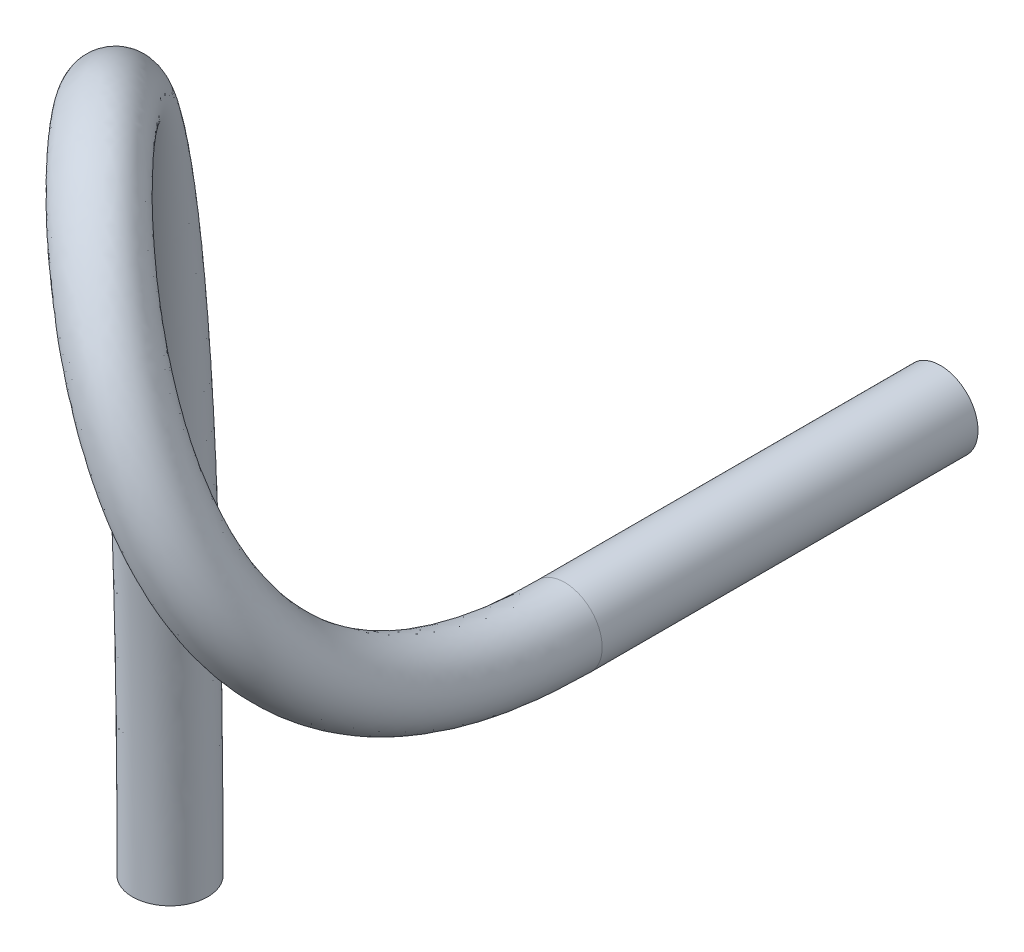
ISO-10303-21;
HEADER;
FILE_DESCRIPTION(('STEP AP214'),'2;1');
FILE_NAME('part.step','',(''),(''),'','','');
FILE_SCHEMA(('AUTOMOTIVE_DESIGN { 1 0 10303 214 1 1 1 1 }'));
ENDSEC;
DATA;
#1=APPLICATION_CONTEXT('core data for automotive mechanical design processes');
#2=APPLICATION_PROTOCOL_DEFINITION('international standard','automotive_design',2000,#1);
#3=PRODUCT_CONTEXT('',#1,'mechanical');
#4=PRODUCT('Part','Part','',(#3));
#5=PRODUCT_RELATED_PRODUCT_CATEGORY('part','',(#4));
#6=PRODUCT_DEFINITION_FORMATION('','',#4);
#7=PRODUCT_DEFINITION_CONTEXT('part definition',#1,'design');
#8=PRODUCT_DEFINITION('design','',#6,#7);
#9=PRODUCT_DEFINITION_SHAPE('','',#8);
#10=(LENGTH_UNIT() NAMED_UNIT(*) SI_UNIT(.MILLI.,.METRE.));
#11=(NAMED_UNIT(*) PLANE_ANGLE_UNIT() SI_UNIT($,.RADIAN.));
#12=(NAMED_UNIT(*) SI_UNIT($,.STERADIAN.) SOLID_ANGLE_UNIT());
#13=UNCERTAINTY_MEASURE_WITH_UNIT(LENGTH_MEASURE(1.E-05),#10,'distance_accuracy_value','');
#14=(GEOMETRIC_REPRESENTATION_CONTEXT(3) GLOBAL_UNCERTAINTY_ASSIGNED_CONTEXT((#13)) GLOBAL_UNIT_ASSIGNED_CONTEXT((#10,
#11,#12)) REPRESENTATION_CONTEXT('',''));
#15=CARTESIAN_POINT('',(0.,0.,0.));
#16=DIRECTION('',(0.,0.,1.));
#17=DIRECTION('',(1.,0.,0.));
#18=AXIS2_PLACEMENT_3D('',#15,#16,#17);
#19=CARTESIAN_POINT('',(0.,0.,0.));
#20=DIRECTION('',(0.,1.,0.));
#21=DIRECTION('',(0.,0.,1.));
#22=AXIS2_PLACEMENT_3D('',#19,#20,#21);
#23=PLANE('',#22);
#24=CARTESIAN_POINT('',(0.,0.,0.));
#25=DIRECTION('',(0.,1.,0.));
#26=DIRECTION('',(0.,0.,1.));
#27=AXIS2_PLACEMENT_3D('',#24,#25,#26);
#28=CIRCLE('',#27,0.75);
#29=CARTESIAN_POINT('',(0.,0.,0.75));
#30=VERTEX_POINT('',#29);
#31=EDGE_CURVE('E439',#30,#30,#28,.T.);
#32=ORIENTED_EDGE('',*,*,#31,.T.);
#33=EDGE_LOOP('',(#32));
#34=FACE_BOUND('',#33,.T.);
#35=CARTESIAN_POINT('',(0.,0.,0.));
#36=DIRECTION('',(0.,1.,0.));
#37=DIRECTION('',(0.,0.,1.));
#38=AXIS2_PLACEMENT_3D('',#35,#36,#37);
#39=CIRCLE('',#38,1.);
#40=CARTESIAN_POINT('',(0.,0.,1.));
#41=VERTEX_POINT('',#40);
#42=EDGE_CURVE('E401',#41,#41,#39,.T.);
#43=ORIENTED_EDGE('',*,*,#42,.F.);
#44=EDGE_LOOP('',(#43));
#45=FACE_BOUND('',#44,.T.);
#46=ADVANCED_FACE('F375',(#34,#45),#23,.F.);
#47=CARTESIAN_POINT('',(0.,0.,1.));
#48=CARTESIAN_POINT('',(0.00899547669460586,2.58069569188552,0.999642366474551));
#49=CARTESIAN_POINT('',(0.109017680083653,7.17772950391107,1.14717694766378));
#50=CARTESIAN_POINT('',(0.474614195177804,12.5035991778398,1.72099673212829));
#51=CARTESIAN_POINT('',(0.928594341117671,15.7533166492565,2.41739798412467));
#52=CARTESIAN_POINT('',(1.35854156297554,17.7054648960383,3.05243784311253));
#53=CARTESIAN_POINT('',(1.70655936488185,18.8626211914071,3.55178766920775));
#54=CARTESIAN_POINT('',(2.04025107157301,19.6589331272487,4.01416041473466));
#55=CARTESIAN_POINT('',(2.34681017564454,20.1901007234536,4.42357429300405));
#56=CARTESIAN_POINT('',(2.62033205464238,20.5333303169958,4.77568777707971));
#57=CARTESIAN_POINT('',(2.88836092381222,20.7592503172169,5.10623361142315));
#58=CARTESIAN_POINT('',(3.18090618077139,20.9013187638106,5.44946496645728));
#59=CARTESIAN_POINT('',(3.50375121959266,20.9416153026625,5.8039222611237));
#60=CARTESIAN_POINT('',(3.8758670365568,20.8590510586798,6.17753267987099));
#61=CARTESIAN_POINT('',(4.27876556045988,20.6501687054402,6.53985933744654));
#62=CARTESIAN_POINT('',(4.75957544411078,20.2800926207994,6.91584908911165));
#63=CARTESIAN_POINT('',(5.32104194657545,19.7113048221067,7.27113905301369));
#64=CARTESIAN_POINT('',(5.95253291569836,18.9320024086628,7.55397077978194));
#65=CARTESIAN_POINT('',(6.57944741814848,18.0417920794717,7.71234129109562));
#66=CARTESIAN_POINT('',(7.17869323391894,17.085448265498,7.7304533356402));
#67=CARTESIAN_POINT('',(7.73152214897381,16.1059163373045,7.59045761003957));
#68=CARTESIAN_POINT('',(8.22582951047412,15.1451875720223,7.27351358489649));
#69=CARTESIAN_POINT('',(8.65595705369681,14.2407651228999,6.76118485168429));
#70=CARTESIAN_POINT('',(9.02130398702978,13.4213815328392,6.03050929216346));
#71=CARTESIAN_POINT('',(9.29752457312053,12.7697497131797,5.12679124578931));
#72=CARTESIAN_POINT('',(9.49912776056318,12.280039069985,4.08279682395979));
#73=CARTESIAN_POINT('',(9.63832510361712,11.9378088119056,2.95010641614189));
#74=CARTESIAN_POINT('',(9.72971390534701,11.7178160422027,1.6077131631795));
#75=CARTESIAN_POINT('',(9.75553823348567,11.6664160401513,0.56061269576655));
#76=CARTESIAN_POINT('',(9.75819649130501,11.6706172936093,0.));
#77=CARTESIAN_POINT('',(-2.,0.,1.));
#78=CARTESIAN_POINT('',(-1.99069363358121,2.60299480784686,1.01827528736273));
#79=CARTESIAN_POINT('',(-1.89004965074379,7.24462685179503,1.20307571032826));
#80=CARTESIAN_POINT('',(-1.51642799449076,12.6601117879054,1.8502475161555));
#81=CARTESIAN_POINT('',(-1.04582700928725,16.0077868684583,2.62640556687591));
#82=CARTESIAN_POINT('',(-0.58864240216963,18.05971192098,3.34751507552876));
#83=CARTESIAN_POINT('',(-0.209267904874084,19.3034761519976,3.92769885524247));
#84=CARTESIAN_POINT('',(0.168411708738769,20.1890864489142,4.48574342973555));
#85=CARTESIAN_POINT('',(0.5326319078657,20.8039152050375,5.00581538446898));
#86=CARTESIAN_POINT('',(0.874677096685425,21.2170590057599,5.47874858809769));
#87=CARTESIAN_POINT('',(1.22877966911925,21.4961621864306,5.95104963716474));
#88=CARTESIAN_POINT('',(1.63255659198766,21.6640080526917,6.46808007499253));
#89=CARTESIAN_POINT('',(2.08512503965221,21.6751201376597,7.01656827189132));
#90=CARTESIAN_POINT('',(2.58048739540734,21.4889676664137,7.57138424292693));
#91=CARTESIAN_POINT('',(3.06975279972445,21.1260519647629,8.06512238217086));
#92=CARTESIAN_POINT('',(3.6007036457886,20.5529923922702,8.52849806206576));
#93=CARTESIAN_POINT('',(4.16455760129023,19.7421025292513,8.90976520044779));
#94=CARTESIAN_POINT('',(4.75554871297019,18.7013163653551,9.1470682275763));
#95=CARTESIAN_POINT('',(5.32738859521832,17.5723042513418,9.20696434060799));
#96=CARTESIAN_POINT('',(5.88027532420667,16.4084904010342,9.09955074256618));
#97=CARTESIAN_POINT('',(6.40699022453186,15.2470678499515,8.82507544819158));
#98=CARTESIAN_POINT('',(6.89647073639982,14.1185803778359,8.36669749302488));
#99=CARTESIAN_POINT('',(7.33710813014434,13.0555532285738,7.69576478126189));
#100=CARTESIAN_POINT('',(7.71767044585677,12.0955373747514,6.77955307503088));
#101=CARTESIAN_POINT('',(8.00159480707079,11.3481781961615,5.68593263774703));
#102=CARTESIAN_POINT('',(8.20076619876206,10.8058169517391,4.46884741750735));
#103=CARTESIAN_POINT('',(8.33064677939086,10.4415737915848,3.19011037660499));
#104=CARTESIAN_POINT('',(8.40728668316858,10.2193923953641,1.71614694394311));
#105=CARTESIAN_POINT('',(8.42057276794718,10.1778701462785,0.596757289354422));
#106=CARTESIAN_POINT('',(8.41696190408649,10.1870102762193,0.));
#107=CARTESIAN_POINT('',(-2.,0.,-1.));
#108=CARTESIAN_POINT('',(-2.00868458697042,2.64396399797926,-0.981009445586372));
#109=CARTESIAN_POINT('',(-1.94402251091136,7.3675344221921,-0.794778488519048));
#110=CARTESIAN_POINT('',(-1.62483607234795,12.960481439362,-0.127778696730119));
#111=CARTESIAN_POINT('',(-1.19061334777501,16.5134979972538,0.691747254824976));
#112=CARTESIAN_POINT('',(-0.74224896562198,18.7838817564187,1.48629129518241));
#113=CARTESIAN_POINT('',(-0.351390540888146,20.2225340604894,2.1518524379648));
#114=CARTESIAN_POINT('',(0.0638617140289006,21.3158557981678,2.8298496707215));
#115=CARTESIAN_POINT('',(0.495086080500928,22.1349429410731,3.50615512662986));
#116=CARTESIAN_POINT('',(0.929234316134916,22.7319662981724,4.1631660558001));
#117=CARTESIAN_POINT('',(1.41021822188391,23.1758636073831,4.86463459564465));
#118=CARTESIAN_POINT('',(1.98833456247443,23.48048411139,5.67677846702687));
#119=CARTESIAN_POINT('',(2.65525931921515,23.5575602033966,6.57379044524499));
#120=CARTESIAN_POINT('',(3.36769375198115,23.3395543294759,7.48631022895445));
#121=CARTESIAN_POINT('',(4.02784667880527,22.8782263285493,8.29082758685184));
#122=CARTESIAN_POINT('',(4.69092775756762,22.1589801594903,9.05232685511908));
#123=CARTESIAN_POINT('',(5.33497370813989,21.1629660255642,9.71958248997937));
#124=CARTESIAN_POINT('',(5.95725371490682,19.8935946196011,10.2313045369331));
#125=CARTESIAN_POINT('',(6.53307709225469,18.5028536266573,10.5180424042188));
#126=CARTESIAN_POINT('',(7.09059718970213,17.0439036883616,10.5720711814083));
#127=CARTESIAN_POINT('',(7.64186259325091,15.5573323888413,10.3799208739145));
#128=CARTESIAN_POINT('',(8.18179088212238,14.0789862433018,9.91301495998979));
#129=CARTESIAN_POINT('',(8.69186068942085,12.6556694788852,9.1301575448054));
#130=CARTESIAN_POINT('',(9.1438124717998,11.3567532720992,7.99513201088831));
#131=CARTESIAN_POINT('',(9.47685816082977,10.3571520750492,6.62521368831641));
#132=CARTESIAN_POINT('',(9.70006927138573,9.64993511849103,5.13338535540477));
#133=CARTESIAN_POINT('',(9.83610106434413,9.18611653480674,3.61136372944558));
#134=CARTESIAN_POINT('',(9.90684324747456,8.90336532889309,1.91046712711266));
#135=CARTESIAN_POINT('',(9.90949630097583,8.8450380659758,0.661530683744272));
#136=CARTESIAN_POINT('',(9.90056892147646,8.84577568900077,0.));
#137=CARTESIAN_POINT('',(0.,0.,-1.));
#138=CARTESIAN_POINT('',(-0.00899547669460571,2.62166488201792,-0.999642366474551));
#139=CARTESIAN_POINT('',(0.0550448199160775,7.30063707430814,-0.850677251183524));
#140=CARTESIAN_POINT('',(0.366206117320614,12.8039688292963,-0.257029480757328));
#141=CARTESIAN_POINT('',(0.783808002629909,16.259027778052,0.482739672073741));
#142=CARTESIAN_POINT('',(1.20493499952319,18.4296347314769,1.19121406276618));
#143=CARTESIAN_POINT('',(1.56443672886779,19.7816790998988,1.77594125193008));
#144=CARTESIAN_POINT('',(1.93570107686314,20.7857024765023,2.35826665572061));
#145=CARTESIAN_POINT('',(2.30926434827977,21.5211284594892,2.92391403516493));
#146=CARTESIAN_POINT('',(2.67488927409187,22.0482376094083,3.46010524478212));
#147=CARTESIAN_POINT('',(3.06979947657688,22.4389517381694,4.01981856990307));
#148=CARTESIAN_POINT('',(3.53668415125817,22.7177948225089,4.65816335849162));
#149=CARTESIAN_POINT('',(4.07388549915559,22.8240553683994,5.36114443447737));
#150=CARTESIAN_POINT('',(4.66307339313061,22.709637721742,6.0924586658985));
#151=CARTESIAN_POINT('',(5.2368594395407,22.4023430692266,6.76556454212753));
#152=CARTESIAN_POINT('',(5.8497995558898,21.8860803880194,7.43967788216496));
#153=CARTESIAN_POINT('',(6.49145805342512,21.1321683184196,8.08095634254527));
#154=CARTESIAN_POINT('',(7.15423791763498,20.1242806629087,8.63820708913877));
#155=CARTESIAN_POINT('',(7.78513591518485,18.9723414547872,9.02341935470645));
#156=CARTESIAN_POINT('',(8.3890150994144,17.7208615528253,9.20297377448237));
#157=CARTESIAN_POINT('',(8.96639451769286,16.4161808761943,9.1453030357625));
#158=CARTESIAN_POINT('',(9.51114965619668,15.1055934374882,8.81983105186141));
#159=CARTESIAN_POINT('',(10.0107096129733,13.8408813732112,8.1955776152278));
#160=CARTESIAN_POINT('',(10.4474460129728,12.682597430187,7.24608822802089));
#161=CARTESIAN_POINT('',(10.7727879268795,11.7787235920674,6.06607229635868));
#162=CARTESIAN_POINT('',(10.9984308331868,11.1241572367369,4.7473347618572));
#163=CARTESIAN_POINT('',(11.1437793885704,10.6823515551275,3.37135976898249));
#164=CARTESIAN_POINT('',(11.229270469653,10.4017889757317,1.80203334634905));
#165=CARTESIAN_POINT('',(11.2444617665143,10.3335839598487,0.625386090156399));
#166=CARTESIAN_POINT('',(11.241803508695,10.3293827063907,0.));
#167=CARTESIAN_POINT('',(2.,0.,-1.));
#168=CARTESIAN_POINT('',(1.99069363358121,2.59936576605657,-1.01827528736273));
#169=CARTESIAN_POINT('',(2.05411215074352,7.23373972642419,-0.906576013847999));
#170=CARTESIAN_POINT('',(2.35724830698918,12.6474562192307,-0.386280264784538));
#171=CARTESIAN_POINT('',(2.75822935303483,16.0045575588503,0.273732089322504));
#172=CARTESIAN_POINT('',(3.15211896466836,18.0753877065352,0.896136830349953));
#173=CARTESIAN_POINT('',(3.48026399862372,19.3408241393083,1.40003006589536));
#174=CARTESIAN_POINT('',(3.80754043969738,20.2555491548369,1.88668364071973));
#175=CARTESIAN_POINT('',(4.12344261605861,20.9073139779053,2.3416729437));
#176=CARTESIAN_POINT('',(4.42054423204883,21.3645089206443,2.75704443376413));
#177=CARTESIAN_POINT('',(4.72938073126986,21.7020398689558,3.17500254416148));
#178=CARTESIAN_POINT('',(5.0850337400419,21.9551055336278,3.63954824995638));
#179=CARTESIAN_POINT('',(5.49251167909605,22.0905505334022,4.14849842370975));
#180=CARTESIAN_POINT('',(5.95845303428006,22.0797211140082,4.69860710284256));
#181=CARTESIAN_POINT('',(6.44587220027613,21.926459809904,5.24030149740321));
#182=CARTESIAN_POINT('',(7.00867135421198,21.6131806165486,5.82702890921084));
#183=CARTESIAN_POINT('',(7.64794239871034,21.101370611275,6.44233019511117));
#184=CARTESIAN_POINT('',(8.35122212036314,20.3549667062164,7.04510964134441));
#185=CARTESIAN_POINT('',(9.03719473811501,19.4418292829171,7.52879630519409));
#186=CARTESIAN_POINT('',(9.68743300912667,18.3978194172891,7.83387636755639));
#187=CARTESIAN_POINT('',(10.2909264421348,17.2750293635473,7.91068519761049));
#188=CARTESIAN_POINT('',(10.840508430271,16.1322006316746,7.72664714373303));
#189=CARTESIAN_POINT('',(11.3295585365258,15.0260932675373,7.2609976856502));
#190=CARTESIAN_POINT('',(11.7510795541458,14.0084415882748,6.49704444515347));
#191=CARTESIAN_POINT('',(12.0687176929292,13.2002951090855,5.50693090440095));
#192=CARTESIAN_POINT('',(12.296792394988,12.5983793549829,4.36128416830964));
#193=CARTESIAN_POINT('',(12.4514577127967,12.1785865754483,3.1313558085194));
#194=CARTESIAN_POINT('',(12.5516976918314,11.9002126225704,1.69359956558543));
#195=CARTESIAN_POINT('',(12.5794272320528,11.8221298537215,0.589241496568527));
#196=CARTESIAN_POINT('',(12.5830380959135,11.8129897237807,0.));
#197=CARTESIAN_POINT('',(2.,0.,1.));
#198=CARTESIAN_POINT('',(2.00868458697042,2.55839657592417,0.981009445586372));
#199=CARTESIAN_POINT('',(2.1080850109111,7.11083215602712,1.09127818499931));
#200=CARTESIAN_POINT('',(2.46565638484637,12.3470865677742,1.59174594810108));
#201=CARTESIAN_POINT('',(2.90301569152259,15.4988464300547,2.20839040137343));
#202=CARTESIAN_POINT('',(3.30572552812071,17.3512178710965,2.7573606106963));
#203=CARTESIAN_POINT('',(3.62238663463778,18.4217662308166,3.17587648317303));
#204=CARTESIAN_POINT('',(3.91209043440725,19.1287798055832,3.54257739973378));
#205=CARTESIAN_POINT('',(4.16098844342338,19.5762862418697,3.84133320153913));
#206=CARTESIAN_POINT('',(4.36598701259933,19.8496016282318,4.07262696606172));
#207=CARTESIAN_POINT('',(4.5479421785052,20.0223384480033,4.26141758568156));
#208=CARTESIAN_POINT('',(4.72925576955513,20.1386294749295,4.43084985792204));
#209=CARTESIAN_POINT('',(4.92237739953311,20.2081104676653,4.59127625035607));
#210=CARTESIAN_POINT('',(5.17124667770625,20.229134450946,4.78368111681505));
#211=CARTESIAN_POINT('',(5.48777832119531,20.1742854461176,5.01459629272222));
#212=CARTESIAN_POINT('',(5.91844724243296,20.0071928493286,5.30320011615753));
#213=CARTESIAN_POINT('',(6.47752629186068,19.6805071149622,5.63251290557959));
#214=CARTESIAN_POINT('',(7.14951711842652,19.1626884519705,5.96087333198757));
#215=CARTESIAN_POINT('',(7.83150624107865,18.5112799076017,6.21771824158326));
#216=CARTESIAN_POINT('',(8.47711114363121,17.7624061299618,6.36135592871422));
#217=CARTESIAN_POINT('',(9.05605407341576,16.9647648246575,6.35583977188756));
#218=CARTESIAN_POINT('',(9.55518828454841,16.1717947662087,6.18032967676812));
#219=CARTESIAN_POINT('',(9.97480597724928,15.4259770172259,5.82660492210669));
#220=CARTESIAN_POINT('',(10.3249375282028,14.747225690927,5.28146550929604));
#221=CARTESIAN_POINT('',(10.5934543391703,14.1913212301978,4.56764985383158));
#222=CARTESIAN_POINT('',(10.7974893223643,13.7542611882309,3.69674623041223));
#223=CARTESIAN_POINT('',(10.9460034278434,13.4340438322263,2.7101024556788));
#224=CARTESIAN_POINT('',(11.0521411275254,13.2162396890414,1.49927938241588));
#225=CARTESIAN_POINT('',(11.0905036990242,13.1549619340242,0.524468102178678));
#226=CARTESIAN_POINT('',(11.0994310785235,13.1542243109992,0.));
#227=CARTESIAN_POINT('',(0.,0.,1.));
#228=CARTESIAN_POINT('',(0.00899547669460586,2.58069569188552,0.999642366474551));
#229=CARTESIAN_POINT('',(0.109017680083653,7.17772950391107,1.14717694766378));
#230=CARTESIAN_POINT('',(0.474614195177804,12.5035991778398,1.72099673212829));
#231=CARTESIAN_POINT('',(0.928594341117671,15.7533166492565,2.41739798412467));
#232=CARTESIAN_POINT('',(1.35854156297554,17.7054648960383,3.05243784311253));
#233=CARTESIAN_POINT('',(1.70655936488185,18.8626211914071,3.55178766920775));
#234=CARTESIAN_POINT('',(2.04025107157301,19.6589331272487,4.01416041473466));
#235=CARTESIAN_POINT('',(2.34681017564454,20.1901007234536,4.42357429300405));
#236=CARTESIAN_POINT('',(2.62033205464238,20.5333303169958,4.77568777707971));
#237=CARTESIAN_POINT('',(2.88836092381222,20.7592503172169,5.10623361142315));
#238=CARTESIAN_POINT('',(3.18090618077139,20.9013187638106,5.44946496645728));
#239=CARTESIAN_POINT('',(3.50375121959266,20.9416153026625,5.8039222611237));
#240=CARTESIAN_POINT('',(3.8758670365568,20.8590510586798,6.17753267987099));
#241=CARTESIAN_POINT('',(4.27876556045988,20.6501687054402,6.53985933744654));
#242=CARTESIAN_POINT('',(4.75957544411078,20.2800926207994,6.91584908911165));
#243=CARTESIAN_POINT('',(5.32104194657545,19.7113048221067,7.27113905301369));
#244=CARTESIAN_POINT('',(5.95253291569836,18.9320024086628,7.55397077978194));
#245=CARTESIAN_POINT('',(6.57944741814848,18.0417920794717,7.71234129109562));
#246=CARTESIAN_POINT('',(7.17869323391894,17.085448265498,7.7304533356402));
#247=CARTESIAN_POINT('',(7.73152214897381,16.1059163373045,7.59045761003957));
#248=CARTESIAN_POINT('',(8.22582951047412,15.1451875720223,7.27351358489649));
#249=CARTESIAN_POINT('',(8.65595705369681,14.2407651228999,6.76118485168429));
#250=CARTESIAN_POINT('',(9.02130398702978,13.4213815328392,6.03050929216346));
#251=CARTESIAN_POINT('',(9.29752457312053,12.7697497131797,5.12679124578931));
#252=CARTESIAN_POINT('',(9.49912776056318,12.280039069985,4.08279682395979));
#253=CARTESIAN_POINT('',(9.63832510361712,11.9378088119056,2.95010641614189));
#254=CARTESIAN_POINT('',(9.72971390534701,11.7178160422027,1.6077131631795));
#255=CARTESIAN_POINT('',(9.75553823348567,11.6664160401513,0.56061269576655));
#256=CARTESIAN_POINT('',(9.75819649130501,11.6706172936093,0.));
#257=(BOUNDED_SURFACE() B_SPLINE_SURFACE(3,3,((#47,#48,#49,#50,#51,#52,#53,#54,#55,#56,#57,#58,
#59,#60,#61,#62,#63,#64,#65,#66,#67,#68,#69,#70,#71,#72,#73,#74,#75,#76),(#77,#78,#79,#80,#81,
#82,#83,#84,#85,#86,#87,#88,#89,#90,#91,#92,#93,#94,#95,#96,#97,#98,#99,#100,#101,#102,#103,
#104,#105,#106),(#107,#108,#109,#110,#111,#112,#113,#114,#115,#116,#117,#118,#119,#120,#121,
#122,#123,#124,#125,#126,#127,#128,#129,#130,#131,#132,#133,#134,#135,#136),(#137,#138,#139,
#140,#141,#142,#143,#144,#145,#146,#147,#148,#149,#150,#151,#152,#153,#154,#155,#156,#157,#158,
#159,#160,#161,#162,#163,#164,#165,#166),(#167,#168,#169,#170,#171,#172,#173,#174,#175,#176,
#177,#178,#179,#180,#181,#182,#183,#184,#185,#186,#187,#188,#189,#190,#191,#192,#193,#194,#195,
#196),(#197,#198,#199,#200,#201,#202,#203,#204,#205,#206,#207,#208,#209,#210,#211,#212,#213,
#214,#215,#216,#217,#218,#219,#220,#221,#222,#223,#224,#225,#226),(#227,#228,#229,#230,#231,
#232,#233,#234,#235,#236,#237,#238,#239,#240,#241,#242,#243,#244,#245,#246,#247,#248,#249,#250,
#251,#252,#253,#254,#255,#256)),.UNSPECIFIED.,.T.,.F.,.F.) B_SPLINE_SURFACE_WITH_KNOTS((4,3,4),
(4,1,1,1,1,1,1,1,1,1,1,1,1,1,1,1,1,1,1,1,1,1,1,1,1,1,1,4),(0.,0.5,1.),(0.,0.0625,
0.124999999999795,0.187499999999832,0.218749999999999,0.25,0.281249999999953,0.304687499999883,
0.328125,0.3515625,0.374999999999839,0.406249999999991,0.4375,0.46875,0.500000000000055,
0.541666666666667,0.583333333333333,0.625,0.666666666666667,0.708333333333333,0.75,
0.791666666667163,0.833333333333333,0.875,0.906250000000008,0.9375,0.96875,1.),
.UNSPECIFIED.) GEOMETRIC_REPRESENTATION_ITEM() RATIONAL_B_SPLINE_SURFACE(((1.,1.,1.,1.,1.,1.,1.,
1.,1.,1.,1.,1.,1.,1.,1.,1.,1.,1.,1.,1.,1.,1.,1.,1.,1.,1.,1.,1.,1.,1.),(0.333333333333333,
0.333333333333333,0.333333333333333,0.333333333333333,0.333333333333333,0.333333333333333,
0.333333333333333,0.333333333333333,0.333333333333334,0.333333333333333,0.333333333333333,
0.333333333333333,0.333333333333333,0.333333333333333,0.333333333333333,0.333333333333333,
0.333333333333333,0.333333333333333,0.333333333333333,0.333333333333333,0.333333333333333,
0.333333333333333,0.333333333333333,0.333333333333333,0.333333333333333,0.333333333333333,
0.333333333333333,0.333333333333333,0.333333333333333,0.333333333333333),(0.333333333333333,
0.333333333333333,0.333333333333333,0.333333333333333,0.333333333333333,0.333333333333333,
0.333333333333333,0.333333333333333,0.333333333333334,0.333333333333333,0.333333333333333,
0.333333333333333,0.333333333333333,0.333333333333333,0.333333333333333,0.333333333333333,
0.333333333333333,0.333333333333333,0.333333333333333,0.333333333333333,0.333333333333333,
0.333333333333333,0.333333333333333,0.333333333333333,0.333333333333333,0.333333333333333,
0.333333333333333,0.333333333333333,0.333333333333333,0.333333333333333),(1.,1.,1.,1.,1.,1.,1.,
1.,1.,1.,1.,1.,1.,1.,1.,1.,1.,1.,1.,1.,1.,1.,1.,1.,1.,1.,1.,1.,1.,1.),(0.333333333333333,
0.333333333333333,0.333333333333333,0.333333333333333,0.333333333333333,0.333333333333333,
0.333333333333333,0.333333333333333,0.333333333333334,0.333333333333333,0.333333333333333,
0.333333333333333,0.333333333333333,0.333333333333333,0.333333333333333,0.333333333333333,
0.333333333333333,0.333333333333333,0.333333333333333,0.333333333333333,0.333333333333333,
0.333333333333333,0.333333333333333,0.333333333333333,0.333333333333333,0.333333333333333,
0.333333333333333,0.333333333333333,0.333333333333333,0.333333333333333),(0.333333333333333,
0.333333333333333,0.333333333333333,0.333333333333333,0.333333333333333,0.333333333333333,
0.333333333333333,0.333333333333333,0.333333333333334,0.333333333333333,0.333333333333333,
0.333333333333333,0.333333333333333,0.333333333333333,0.333333333333333,0.333333333333333,
0.333333333333333,0.333333333333333,0.333333333333333,0.333333333333333,0.333333333333333,
0.333333333333333,0.333333333333333,0.333333333333333,0.333333333333333,0.333333333333333,
0.333333333333333,0.333333333333333,0.333333333333333,0.333333333333333),(1.,1.,1.,1.,1.,1.,1.,
1.,1.,1.,1.,1.,1.,1.,1.,1.,1.,1.,1.,1.,1.,1.,1.,1.,1.,1.,1.,1.,1.,1.))) REPRESENTATION_ITEM('') SURFACE());
#258=CARTESIAN_POINT('',(0.,0.,1.));
#259=CARTESIAN_POINT('',(0.00899547669460586,2.58069569188552,0.999642366474551));
#260=CARTESIAN_POINT('',(0.109017680083653,7.17772950391107,1.14717694766378));
#261=CARTESIAN_POINT('',(0.474614195177804,12.5035991778398,1.72099673212829));
#262=CARTESIAN_POINT('',(0.928594341117671,15.7533166492565,2.41739798412467));
#263=CARTESIAN_POINT('',(1.35854156297554,17.7054648960383,3.05243784311253));
#264=CARTESIAN_POINT('',(1.70655936488185,18.8626211914071,3.55178766920775));
#265=CARTESIAN_POINT('',(2.04025107157301,19.6589331272487,4.01416041473466));
#266=CARTESIAN_POINT('',(2.34681017564454,20.1901007234536,4.42357429300405));
#267=CARTESIAN_POINT('',(2.62033205464238,20.5333303169958,4.77568777707971));
#268=CARTESIAN_POINT('',(2.88836092381222,20.7592503172169,5.10623361142315));
#269=CARTESIAN_POINT('',(3.18090618077139,20.9013187638106,5.44946496645728));
#270=CARTESIAN_POINT('',(3.50375121959266,20.9416153026625,5.8039222611237));
#271=CARTESIAN_POINT('',(3.8758670365568,20.8590510586798,6.17753267987099));
#272=CARTESIAN_POINT('',(4.27876556045988,20.6501687054402,6.53985933744654));
#273=CARTESIAN_POINT('',(4.75957544411078,20.2800926207994,6.91584908911165));
#274=CARTESIAN_POINT('',(5.32104194657545,19.7113048221067,7.27113905301369));
#275=CARTESIAN_POINT('',(5.95253291569836,18.9320024086628,7.55397077978194));
#276=CARTESIAN_POINT('',(6.57944741814848,18.0417920794717,7.71234129109562));
#277=CARTESIAN_POINT('',(7.17869323391894,17.085448265498,7.7304533356402));
#278=CARTESIAN_POINT('',(7.73152214897381,16.1059163373045,7.59045761003957));
#279=CARTESIAN_POINT('',(8.22582951047412,15.1451875720223,7.27351358489649));
#280=CARTESIAN_POINT('',(8.65595705369681,14.2407651228999,6.76118485168429));
#281=CARTESIAN_POINT('',(9.02130398702978,13.4213815328392,6.03050929216346));
#282=CARTESIAN_POINT('',(9.29752457312053,12.7697497131797,5.12679124578931));
#283=CARTESIAN_POINT('',(9.49912776056318,12.280039069985,4.08279682395979));
#284=CARTESIAN_POINT('',(9.63832510361712,11.9378088119056,2.95010641614189));
#285=CARTESIAN_POINT('',(9.72971390534701,11.7178160422027,1.6077131631795));
#286=CARTESIAN_POINT('',(9.75553823348567,11.6664160401513,0.56061269576655));
#287=CARTESIAN_POINT('',(9.75819649130501,11.6706172936093,0.));
#288=B_SPLINE_CURVE_WITH_KNOTS('',3,(#258,#259,#260,#261,#262,#263,#264,#265,#266,#267,#268,
#269,#270,#271,#272,#273,#274,#275,#276,#277,#278,#279,#280,#281,#282,#283,#284,#285,#286,#287),
.UNSPECIFIED.,.F.,.F.,(4,1,1,1,1,1,1,1,1,1,1,1,1,1,1,1,1,1,1,1,1,1,1,1,1,1,1,4),(0.,0.0625,
0.124999999999795,0.187499999999832,0.218749999999999,0.25,0.281249999999953,0.304687499999883,
0.328125,0.3515625,0.374999999999839,0.406249999999991,0.4375,0.46875,0.500000000000055,
0.541666666666667,0.583333333333333,0.625,0.666666666666667,0.708333333333333,0.75,
0.791666666667163,0.833333333333333,0.875,0.906250000000008,0.9375,0.96875,1.),.UNSPECIFIED.);
#289=CARTESIAN_POINT('',(9.758196491305,11.6706172936093,0.));
#290=VERTEX_POINT('',#289);
#291=EDGE_CURVE('E381',#41,#290,#288,.T.);
#292=CARTESIAN_POINT('',(10.5,11.,0.));
#293=DIRECTION('',(0.,0.,-1.));
#294=DIRECTION('',(-0.741803508694986,0.67061729360926,0.));
#295=AXIS2_PLACEMENT_3D('',#292,#293,#294);
#296=CIRCLE('',#295,1.);
#297=EDGE_CURVE('E12',#290,#290,#296,.T.);
#298=ORIENTED_EDGE('',*,*,#42,.T.);
#299=ORIENTED_EDGE('',*,*,#291,.T.);
#300=ORIENTED_EDGE('',*,*,#297,.F.);
#301=ORIENTED_EDGE('',*,*,#291,.F.);
#302=EDGE_LOOP('',(#298,#299,#300,#301));
#303=FACE_BOUND('',#302,.T.);
#304=ADVANCED_FACE('F407',(#303),#257,.F.);
#305=CARTESIAN_POINT('',(0.,0.,0.75));
#306=CARTESIAN_POINT('',(0.0067466075209544,2.58581684065207,0.749731774855913));
#307=CARTESIAN_POINT('',(0.102271072562706,7.19309295021071,0.897445172807869));
#308=CARTESIAN_POINT('',(0.461063185445655,12.5411453842718,1.47374345551759));
#309=CARTESIAN_POINT('',(0.910496048806701,15.8165305403559,2.1755656951183));
#310=CARTESIAN_POINT('',(1.33934074254399,17.7959861254681,2.81978487056924));
#311=CARTESIAN_POINT('',(1.68879403538009,18.9775034299686,3.32980686704804));
#312=CARTESIAN_POINT('',(2.02718232223427,19.7997792959054,3.8071736948579));
#313=CARTESIAN_POINT('',(2.34211694722394,20.3564791904581,4.23611676077416));
#314=CARTESIAN_POINT('',(2.62715170707357,20.7226937285474,4.61123996054251));
#315=CARTESIAN_POINT('',(2.91104074290781,20.969212994836,4.97043173123314));
#316=CARTESIAN_POINT('',(3.22537842708224,21.1283782711478,5.35055226546157));
#317=CARTESIAN_POINT('',(3.57501800453803,21.1769203108796,5.7485750327929));
#318=CARTESIAN_POINT('',(3.97426783112852,21.0903743915626,6.16689842812443));
#319=CARTESIAN_POINT('',(4.39852729534498,20.8691905009135,6.56807248803166));
#320=CARTESIAN_POINT('',(4.89585345808315,20.4808410917019,6.98132768824331));
#321=CARTESIAN_POINT('',(5.46734395993166,19.8889127591459,7.37236621420514));
#322=CARTESIAN_POINT('',(6.10274604094043,19.0810371904436,7.68950031845154));
#323=CARTESIAN_POINT('',(6.73015848027803,18.1581107513862,7.87622604904698));
#324=CARTESIAN_POINT('',(7.32998346710587,17.1648749264139,7.91451839049547));
#325=CARTESIAN_POINT('',(7.88588119506369,16.1446994046657,7.78481328825494));
#326=CARTESIAN_POINT('',(8.38649452868944,15.1402383052055,7.46680326826711));
#327=CARTESIAN_POINT('',(8.82530112360637,14.1907796541888,6.94048394712723));
#328=CARTESIAN_POINT('',(9.19957174027266,13.3290335200077,6.18245665914564));
#329=CARTESIAN_POINT('',(9.4819324923404,12.6458714480406,5.24420137711048));
#330=CARTESIAN_POINT('',(9.68654064464113,12.135553840829,4.16586406619697));
#331=CARTESIAN_POINT('',(9.82650688923628,11.7808766548083,3.00276308524697));
#332=CARTESIAN_POINT('',(9.91715847588525,11.5533126588939,1.63200318607569));
#333=CARTESIAN_POINT('',(9.94165367511425,11.4998120301135,0.568709370065281));
#334=CARTESIAN_POINT('',(9.94364736847876,11.502962970207,0.));
#335=CARTESIAN_POINT('',(-1.5,0.,0.75));
#336=CARTESIAN_POINT('',(-1.49302022518591,2.60254117762307,0.763706465522047));
#337=CARTESIAN_POINT('',(-1.39702942555788,7.24326596112367,0.939369244806226));
#338=CARTESIAN_POINT('',(-1.03221845680577,12.6585298418211,1.57068154353799));
#339=CARTESIAN_POINT('',(-0.570319963996991,16.0073832047573,2.33232138218173));
#340=CARTESIAN_POINT('',(-0.121047231314882,18.0616713941744,3.04109279488141));
#341=CARTESIAN_POINT('',(0.251923583063142,19.3081446504115,3.61174025657408));
#342=CARTESIAN_POINT('',(0.623302800108594,20.1973942871545,4.16086095610857));
#343=CARTESIAN_POINT('',(0.981483246389813,20.816840051646,4.67279757937286));
#344=CARTESIAN_POINT('',(1.31791048860585,21.2354902451204,5.138535568806));
#345=CARTESIAN_POINT('',(1.66635480188807,21.5218968967462,5.60404375053933));
#346=CARTESIAN_POINT('',(2.06411623549444,21.7003952378087,6.11451359686301));
#347=CARTESIAN_POINT('',(2.51104836958269,21.7270489371275,6.65805954086862));
#348=CARTESIAN_POINT('',(3.00273310026643,21.562811847363,7.21228710041639));
#349=CARTESIAN_POINT('',(3.49176772479341,21.2261029454055,7.7120197715749));
#350=CARTESIAN_POINT('',(4.02669960934152,20.685515920305,8.1908144179589));
#351=CARTESIAN_POINT('',(4.59998070096774,19.9120110395043,8.60133582478072));
#352=CARTESIAN_POINT('',(5.20500788889431,18.9080226579628,8.88432340429731));
#353=CARTESIAN_POINT('',(5.79111436308041,17.8059948802887,8.99719333618125));
#354=CARTESIAN_POINT('',(6.35617003482167,16.6571565280661,8.94134144568996));
#355=CARTESIAN_POINT('',(6.89248225173223,15.500563039151,8.71077666686895));
#356=CARTESIAN_POINT('',(7.38947544813372,14.3702829095658,8.28669119936339));
#357=CARTESIAN_POINT('',(7.83616443094202,13.3018707334442,7.64141889431043));
#358=CARTESIAN_POINT('',(8.2218465843929,12.3346504014418,6.7442394962962));
#359=CARTESIAN_POINT('',(8.5099851678031,11.579692810277,5.66355742107877));
#360=CARTESIAN_POINT('',(8.7127694732903,11.0298872521445,4.45540201135764));
#361=CARTESIAN_POINT('',(8.84574814606659,10.6587003895677,3.18276605559429));
#362=CARTESIAN_POINT('',(8.92533805925144,10.4294949237649,1.7133285216484));
#363=CARTESIAN_POINT('',(8.94042957596039,10.3834026097089,0.595817815256185));
#364=CARTESIAN_POINT('',(8.93772142806487,10.3902577071645,0.));
#365=CARTESIAN_POINT('',(-1.5,0.,-0.75));
#366=CARTESIAN_POINT('',(-1.50651344022781,2.63326807022237,-0.735757084189779));
#367=CARTESIAN_POINT('',(-1.43750907068356,7.33544663892148,-0.559021404329254));
#368=CARTESIAN_POINT('',(-1.11352451519866,12.8838070804135,0.0871618838737809));
#369=CARTESIAN_POINT('',(-0.678909717862813,16.3866665513539,0.881327648143533));
#370=CARTESIAN_POINT('',(-0.236252153904145,18.6047987707534,1.64517495962165));
#371=CARTESIAN_POINT('',(0.145331606052596,19.9974380817803,2.27985544361583));
#372=CARTESIAN_POINT('',(0.544890304076193,21.0424712990947,2.91894063684803));
#373=CARTESIAN_POINT('',(0.953323875866235,21.8151108536727,3.54805238599352));
#374=CARTESIAN_POINT('',(1.35882840319297,22.3716707144298,4.15184866958281));
#375=CARTESIAN_POINT('',(1.80243371646157,22.7816729624606,4.78923246939927));
#376=CARTESIAN_POINT('',(2.33094971335952,23.0627522818324,5.52103739088876));
#377=CARTESIAN_POINT('',(2.93864907925489,23.1388789864302,6.32597617088388));
#378=CARTESIAN_POINT('',(3.59313786769679,22.9507518446596,7.14848158993702));
#379=CARTESIAN_POINT('',(4.21033813410402,22.5402337182453,7.88129867508564));
#380=CARTESIAN_POINT('',(4.84436769317579,21.8900067457201,8.58368601274889));
#381=CARTESIAN_POINT('',(5.47779278110499,20.9776586617389,9.2086987919294));
#382=CARTESIAN_POINT('',(6.10628664034678,19.8022313486472,9.69750063631495));
#383=CARTESIAN_POINT('',(6.69538073585769,18.5039069117753,9.98050188388937));
#384=CARTESIAN_POINT('',(7.26391143394326,17.1337164935616,10.0457317748216));
#385=CARTESIAN_POINT('',(7.81863652827152,15.7332614433183,9.87691073616114));
#386=CARTESIAN_POINT('',(8.35346555742564,14.3405873086652,9.44642929958709));
#387=CARTESIAN_POINT('',(8.85222885039941,13.0019579211778,8.71721346696807));
#388=CARTESIAN_POINT('',(9.29145310385018,11.7805623244527,7.65592369818927));
#389=CARTESIAN_POINT('',(9.61643268312233,10.8364232194428,6.3680182090058));
#390=CARTESIAN_POINT('',(9.83724677775805,10.1629758772085,4.9538054647807));
#391=CARTESIAN_POINT('',(9.97483885978154,9.71710744698419,3.49870607022474));
#392=CARTESIAN_POINT('',(10.0500054824809,9.44247462391163,1.85906865902557));
#393=CARTESIAN_POINT('',(10.0571222257319,9.38377854948185,0.644397861048573));
#394=CARTESIAN_POINT('',(10.0504266911073,9.38433176675058,0.));
#395=CARTESIAN_POINT('',(0.,0.,-0.75));
#396=CARTESIAN_POINT('',(-0.00674660752095428,2.61654373325137,-0.749731774855913));
#397=CARTESIAN_POINT('',(0.0617914274370245,7.28527362800851,-0.60094547632761));
#398=CARTESIAN_POINT('',(0.379757127052762,12.7664226228643,-0.00977620414662617));
#399=CARTESIAN_POINT('',(0.801906294940879,16.1958138869526,0.724571961080107));
#400=CARTESIAN_POINT('',(1.22413581995473,18.3391135020471,1.42386703530948));
#401=CARTESIAN_POINT('',(1.58220205836955,19.6667968613374,1.99792205408979));
#402=CARTESIAN_POINT('',(1.94876982620187,20.6448563078456,2.56525337559737));
#403=CARTESIAN_POINT('',(2.31395757670037,21.3547499924848,3.11137156739482));
#404=CARTESIAN_POINT('',(2.66806962166068,21.8588741978568,3.62455306131932));
#405=CARTESIAN_POINT('',(3.0471196574813,22.2289890605504,4.15562045009308));
#406=CARTESIAN_POINT('',(3.49221190494732,22.4907353151716,4.75707605948733));
#407=CARTESIAN_POINT('',(4.00261871421023,22.5887503601823,5.41649166280816));
#408=CARTESIAN_POINT('',(4.56467259855888,22.4783143888592,6.10309291764507));
#409=CARTESIAN_POINT('',(5.11709770465559,22.1833212737533,6.7373513915424));
#410=CARTESIAN_POINT('',(5.71352154191742,21.6853319171169,7.3741992830333));
#411=CARTESIAN_POINT('',(6.34515604006891,20.9545603813805,7.97972918135383));
#412=CARTESIAN_POINT('',(7.0040247923929,19.975245881128,8.50267755046917));
#413=CARTESIAN_POINT('',(7.63442485305531,18.8560227828728,8.8595345967551));
#414=CARTESIAN_POINT('',(8.23772486622747,17.6414348919094,9.0189087196271));
#415=CARTESIAN_POINT('',(8.81203547160298,16.3773978088331,8.95094735754714));
#416=CARTESIAN_POINT('',(9.35048463798136,15.110542704305,8.62654136849079));
#417=CARTESIAN_POINT('',(9.84136554306377,13.8908668419223,8.01627851978486));
#418=CARTESIAN_POINT('',(10.2691782597299,12.7749454430185,7.0941408610387));
#419=CARTESIAN_POINT('',(10.5883800076596,11.9026018572064,5.94866216503751));
#420=CARTESIAN_POINT('',(10.8110179491089,11.2686424658929,4.66426751962003));
#421=CARTESIAN_POINT('',(10.9555976029512,10.8392837122248,3.31870309987742));
#422=CARTESIAN_POINT('',(11.0418258991147,10.5662923590406,1.77774332345285));
#423=CARTESIAN_POINT('',(11.0583463248857,10.5001879698865,0.617289415857668));
#424=CARTESIAN_POINT('',(11.0563526315212,10.4970370297931,0.));
#425=CARTESIAN_POINT('',(1.5,0.,-0.75));
#426=CARTESIAN_POINT('',(1.49302022518591,2.59981939628036,-0.763706465522047));
#427=CARTESIAN_POINT('',(1.56109192555761,7.23510061709554,-0.642869548325967));
#428=CARTESIAN_POINT('',(1.87303876930419,12.649038165315,-0.106714292167033));
#429=CARTESIAN_POINT('',(2.28272230774457,16.0049612225512,0.567816274016679));
#430=CARTESIAN_POINT('',(2.68452379381361,18.0734282333408,1.2025591109973));
#431=CARTESIAN_POINT('',(3.01907251068649,19.3361556408945,1.71598866456375));
#432=CARTESIAN_POINT('',(3.35264934832755,20.2472413165965,2.2115661143467));
#433=CARTESIAN_POINT('',(3.6745912775345,20.8943891312968,2.67469074879612));
#434=CARTESIAN_POINT('',(3.9773108401284,21.3460776812838,3.09725745305583));
#435=CARTESIAN_POINT('',(4.29180559850103,21.6763051586401,3.52200843078689));
#436=CARTESIAN_POINT('',(4.65347409653512,21.9187183485108,3.9931147280859));
#437=CARTESIAN_POINT('',(5.06658834916557,22.0386217339344,4.50700715473245));
#438=CARTESIAN_POINT('',(5.53620732942097,22.0058769330588,5.05770424535311));
#439=CARTESIAN_POINT('',(6.02385727520717,21.8264088292614,5.59340410799916));
#440=CARTESIAN_POINT('',(6.58267539065906,21.4806570885138,6.16471255331771));
#441=CARTESIAN_POINT('',(7.21251929903282,20.931462101022,6.75075957077825));
#442=CARTESIAN_POINT('',(7.90176294443902,20.1482604136088,7.30785446462339));
#443=CARTESIAN_POINT('',(8.57346897025293,19.2081386539702,7.73856730962083));
#444=CARTESIAN_POINT('',(9.21153829851167,18.1491532902572,7.99208566443261));
#445=CARTESIAN_POINT('',(9.80543441493444,17.0215341743478,8.02498397893313));
#446=CARTESIAN_POINT('',(10.3475037185371,15.8804980999447,7.80665343739451));
#447=CARTESIAN_POINT('',(10.8305022357281,14.7797757626669,7.31534357260166));
#448=CARTESIAN_POINT('',(11.2469034156097,13.7693285615844,6.53235802388814));
#449=CARTESIAN_POINT('',(11.5603273321969,12.96878049497,5.52930612106921));
#450=CARTESIAN_POINT('',(11.7847891204597,12.3743090545774,4.37472957445936));
#451=CARTESIAN_POINT('',(11.9363563461209,11.9614599774653,3.1387001295301));
#452=CARTESIAN_POINT('',(12.0336463157486,11.6901100941696,1.69641798788014));
#453=CARTESIAN_POINT('',(12.0595704240396,11.6165973902912,0.590180970666764));
#454=CARTESIAN_POINT('',(12.0622785719351,11.6097422928355,0.));
#455=CARTESIAN_POINT('',(1.5,0.,0.75));
#456=CARTESIAN_POINT('',(1.50651344022781,2.56909250368106,0.735757084189779));
#457=CARTESIAN_POINT('',(1.60157157068329,7.14291993929774,0.855521100809513));
#458=CARTESIAN_POINT('',(1.95434482769708,12.4237609267226,1.37680536749718));
#459=CARTESIAN_POINT('',(2.39131206161039,15.6256778759546,2.01881000805488));
#460=CARTESIAN_POINT('',(2.79972871640287,17.5303008567618,2.59847694625707));
#461=CARTESIAN_POINT('',(3.12566448769704,18.6468622095257,3.047873477522));
#462=CARTESIAN_POINT('',(3.43106184435995,19.4021643046563,3.45348643360724));
#463=CARTESIAN_POINT('',(3.70275064805808,19.8961183292701,3.79943594217547));
#464=CARTESIAN_POINT('',(3.93639292554128,20.2098972119744,4.08394435227902));
#465=CARTESIAN_POINT('',(4.15572668392754,20.4165290929257,4.33681971192695));
#466=CARTESIAN_POINT('',(4.38664061867004,20.556361304487,4.58659093406014));
#467=CARTESIAN_POINT('',(4.63898763949337,20.6267916846317,4.83909052471719));
#468=CARTESIAN_POINT('',(4.94580256199061,20.6179369357622,5.12150975583247));
#469=CARTESIAN_POINT('',(5.30528686589656,20.5122780564216,5.42412520448842));
#470=CARTESIAN_POINT('',(5.76500730682479,20.2761662630988,5.77184095852772));
#471=CARTESIAN_POINT('',(6.33470721889558,19.8658144787874,6.14339660362956));
#472=CARTESIAN_POINT('',(7.00048419298655,19.2540517229243,6.49467723260576));
#473=CARTESIAN_POINT('',(7.66920259747565,18.5102266224836,6.7552587619127));
#474=CARTESIAN_POINT('',(8.30379689939007,17.6725933247617,6.88769533530099));
#475=CARTESIAN_POINT('',(8.87928013839515,16.7888357701805,6.85884990964093));
#476=CARTESIAN_POINT('',(9.38351360924516,15.9101937008453,6.64691533717082));
#477=CARTESIAN_POINT('',(9.81443781627073,15.0796885749333,6.23954899994403));
#478=CARTESIAN_POINT('',(10.1772968961524,14.3234166385735,5.62067382199507));
#479=CARTESIAN_POINT('',(10.4538798168777,13.7120500858042,4.82484533314218));
#480=CARTESIAN_POINT('',(10.660311815992,13.2412204295134,3.8763261210363));
#481=CARTESIAN_POINT('',(10.807265632406,12.9030529200489,2.82276011489965));
#482=CARTESIAN_POINT('',(10.9089788925191,12.6771303940229,1.55067785050298));
#483=CARTESIAN_POINT('',(10.9428777742681,12.6162214505182,0.541600924874377));
#484=CARTESIAN_POINT('',(10.9495733088926,12.6156682332494,0.));
#485=CARTESIAN_POINT('',(0.,0.,0.75));
#486=CARTESIAN_POINT('',(0.0067466075209544,2.58581684065207,0.749731774855913));
#487=CARTESIAN_POINT('',(0.102271072562706,7.19309295021071,0.897445172807869));
#488=CARTESIAN_POINT('',(0.461063185445655,12.5411453842718,1.47374345551759));
#489=CARTESIAN_POINT('',(0.910496048806701,15.8165305403559,2.1755656951183));
#490=CARTESIAN_POINT('',(1.33934074254399,17.7959861254681,2.81978487056924));
#491=CARTESIAN_POINT('',(1.68879403538009,18.9775034299686,3.32980686704804));
#492=CARTESIAN_POINT('',(2.02718232223427,19.7997792959054,3.8071736948579));
#493=CARTESIAN_POINT('',(2.34211694722394,20.3564791904581,4.23611676077416));
#494=CARTESIAN_POINT('',(2.62715170707357,20.7226937285474,4.61123996054251));
#495=CARTESIAN_POINT('',(2.91104074290781,20.969212994836,4.97043173123314));
#496=CARTESIAN_POINT('',(3.22537842708224,21.1283782711478,5.35055226546157));
#497=CARTESIAN_POINT('',(3.57501800453803,21.1769203108796,5.7485750327929));
#498=CARTESIAN_POINT('',(3.97426783112852,21.0903743915626,6.16689842812443));
#499=CARTESIAN_POINT('',(4.39852729534498,20.8691905009135,6.56807248803166));
#500=CARTESIAN_POINT('',(4.89585345808315,20.4808410917019,6.98132768824331));
#501=CARTESIAN_POINT('',(5.46734395993166,19.8889127591459,7.37236621420514));
#502=CARTESIAN_POINT('',(6.10274604094043,19.0810371904436,7.68950031845154));
#503=CARTESIAN_POINT('',(6.73015848027803,18.1581107513862,7.87622604904698));
#504=CARTESIAN_POINT('',(7.32998346710587,17.1648749264139,7.91451839049547));
#505=CARTESIAN_POINT('',(7.88588119506369,16.1446994046657,7.78481328825494));
#506=CARTESIAN_POINT('',(8.38649452868944,15.1402383052055,7.46680326826711));
#507=CARTESIAN_POINT('',(8.82530112360637,14.1907796541888,6.94048394712723));
#508=CARTESIAN_POINT('',(9.19957174027266,13.3290335200077,6.18245665914564));
#509=CARTESIAN_POINT('',(9.4819324923404,12.6458714480406,5.24420137711048));
#510=CARTESIAN_POINT('',(9.68654064464113,12.135553840829,4.16586406619697));
#511=CARTESIAN_POINT('',(9.82650688923628,11.7808766548083,3.00276308524697));
#512=CARTESIAN_POINT('',(9.91715847588525,11.5533126588939,1.63200318607569));
#513=CARTESIAN_POINT('',(9.94165367511425,11.4998120301135,0.568709370065281));
#514=CARTESIAN_POINT('',(9.94364736847876,11.502962970207,0.));
#515=(BOUNDED_SURFACE() B_SPLINE_SURFACE(3,3,((#305,#306,#307,#308,#309,#310,#311,#312,#313,
#314,#315,#316,#317,#318,#319,#320,#321,#322,#323,#324,#325,#326,#327,#328,#329,#330,#331,#332,
#333,#334),(#335,#336,#337,#338,#339,#340,#341,#342,#343,#344,#345,#346,#347,#348,#349,#350,
#351,#352,#353,#354,#355,#356,#357,#358,#359,#360,#361,#362,#363,#364),(#365,#366,#367,#368,
#369,#370,#371,#372,#373,#374,#375,#376,#377,#378,#379,#380,#381,#382,#383,#384,#385,#386,#387,
#388,#389,#390,#391,#392,#393,#394),(#395,#396,#397,#398,#399,#400,#401,#402,#403,#404,#405,
#406,#407,#408,#409,#410,#411,#412,#413,#414,#415,#416,#417,#418,#419,#420,#421,#422,#423,#424),
(#425,#426,#427,#428,#429,#430,#431,#432,#433,#434,#435,#436,#437,#438,#439,#440,#441,#442,#443,
#444,#445,#446,#447,#448,#449,#450,#451,#452,#453,#454),(#455,#456,#457,#458,#459,#460,#461,
#462,#463,#464,#465,#466,#467,#468,#469,#470,#471,#472,#473,#474,#475,#476,#477,#478,#479,#480,
#481,#482,#483,#484),(#485,#486,#487,#488,#489,#490,#491,#492,#493,#494,#495,#496,#497,#498,
#499,#500,#501,#502,#503,#504,#505,#506,#507,#508,#509,#510,#511,#512,#513,#514)),.UNSPECIFIED.,
.T.,.F.,.F.) B_SPLINE_SURFACE_WITH_KNOTS((4,3,4),(4,1,1,1,1,1,1,1,1,1,1,1,1,1,1,1,1,1,1,1,1,1,1,
1,1,1,1,4),(0.,0.5,1.),(0.,0.0625,0.124999999999795,0.187499999999832,0.218749999999999,0.25,
0.281249999999953,0.304687499999883,0.328125,0.3515625,0.374999999999839,0.406249999999991,
0.4375,0.46875,0.500000000000055,0.541666666666667,0.583333333333333,0.625,0.666666666666667,
0.708333333333333,0.75,0.791666666667163,0.833333333333333,0.875,0.906250000000008,0.9375,
0.96875,1.),.UNSPECIFIED.) GEOMETRIC_REPRESENTATION_ITEM() RATIONAL_B_SPLINE_SURFACE(((1.,1.,1.,
1.,1.,1.,1.,1.,1.,1.,1.,1.,1.,1.,1.,1.,1.,1.,1.,1.,1.,1.,1.,1.,1.,1.,1.,1.,1.,1.),
(0.333333333333333,0.333333333333333,0.333333333333333,0.333333333333333,0.333333333333333,
0.333333333333333,0.333333333333333,0.333333333333333,0.333333333333334,0.333333333333333,
0.333333333333333,0.333333333333333,0.333333333333333,0.333333333333333,0.333333333333333,
0.333333333333333,0.333333333333333,0.333333333333333,0.333333333333333,0.333333333333333,
0.333333333333333,0.333333333333333,0.333333333333333,0.333333333333333,0.333333333333333,
0.333333333333333,0.333333333333333,0.333333333333333,0.333333333333333,0.333333333333333),
(0.333333333333333,0.333333333333333,0.333333333333333,0.333333333333333,0.333333333333333,
0.333333333333333,0.333333333333333,0.333333333333333,0.333333333333334,0.333333333333333,
0.333333333333333,0.333333333333333,0.333333333333333,0.333333333333333,0.333333333333333,
0.333333333333333,0.333333333333333,0.333333333333333,0.333333333333333,0.333333333333333,
0.333333333333333,0.333333333333333,0.333333333333333,0.333333333333333,0.333333333333333,
0.333333333333333,0.333333333333333,0.333333333333333,0.333333333333333,0.333333333333333),(1.,
1.,1.,1.,1.,1.,1.,1.,1.,1.,1.,1.,1.,1.,1.,1.,1.,1.,1.,1.,1.,1.,1.,1.,1.,1.,1.,1.,1.,1.),
(0.333333333333333,0.333333333333333,0.333333333333333,0.333333333333333,0.333333333333333,
0.333333333333333,0.333333333333333,0.333333333333333,0.333333333333334,0.333333333333333,
0.333333333333333,0.333333333333333,0.333333333333333,0.333333333333333,0.333333333333333,
0.333333333333333,0.333333333333333,0.333333333333333,0.333333333333333,0.333333333333333,
0.333333333333333,0.333333333333333,0.333333333333333,0.333333333333333,0.333333333333333,
0.333333333333333,0.333333333333333,0.333333333333333,0.333333333333333,0.333333333333333),
(0.333333333333333,0.333333333333333,0.333333333333333,0.333333333333333,0.333333333333333,
0.333333333333333,0.333333333333333,0.333333333333333,0.333333333333334,0.333333333333333,
0.333333333333333,0.333333333333333,0.333333333333333,0.333333333333333,0.333333333333333,
0.333333333333333,0.333333333333333,0.333333333333333,0.333333333333333,0.333333333333333,
0.333333333333333,0.333333333333333,0.333333333333333,0.333333333333333,0.333333333333333,
0.333333333333333,0.333333333333333,0.333333333333333,0.333333333333333,0.333333333333333),(1.,
1.,1.,1.,1.,1.,1.,1.,1.,1.,1.,1.,1.,1.,1.,1.,1.,1.,1.,1.,1.,1.,1.,1.,1.,1.,1.,1.,1.,1.))) REPRESENTATION_ITEM('') SURFACE());
#516=CARTESIAN_POINT('',(0.,0.,0.75));
#517=CARTESIAN_POINT('',(0.0067466075209544,2.58581684065207,0.749731774855913));
#518=CARTESIAN_POINT('',(0.102271072562706,7.19309295021071,0.897445172807869));
#519=CARTESIAN_POINT('',(0.461063185445655,12.5411453842718,1.47374345551759));
#520=CARTESIAN_POINT('',(0.910496048806701,15.8165305403559,2.1755656951183));
#521=CARTESIAN_POINT('',(1.33934074254399,17.7959861254681,2.81978487056924));
#522=CARTESIAN_POINT('',(1.68879403538009,18.9775034299686,3.32980686704804));
#523=CARTESIAN_POINT('',(2.02718232223427,19.7997792959054,3.8071736948579));
#524=CARTESIAN_POINT('',(2.34211694722394,20.3564791904581,4.23611676077416));
#525=CARTESIAN_POINT('',(2.62715170707357,20.7226937285474,4.61123996054251));
#526=CARTESIAN_POINT('',(2.91104074290781,20.969212994836,4.97043173123314));
#527=CARTESIAN_POINT('',(3.22537842708224,21.1283782711478,5.35055226546157));
#528=CARTESIAN_POINT('',(3.57501800453803,21.1769203108796,5.7485750327929));
#529=CARTESIAN_POINT('',(3.97426783112852,21.0903743915626,6.16689842812443));
#530=CARTESIAN_POINT('',(4.39852729534498,20.8691905009135,6.56807248803166));
#531=CARTESIAN_POINT('',(4.89585345808315,20.4808410917019,6.98132768824331));
#532=CARTESIAN_POINT('',(5.46734395993166,19.8889127591459,7.37236621420514));
#533=CARTESIAN_POINT('',(6.10274604094043,19.0810371904436,7.68950031845154));
#534=CARTESIAN_POINT('',(6.73015848027803,18.1581107513862,7.87622604904698));
#535=CARTESIAN_POINT('',(7.32998346710587,17.1648749264139,7.91451839049547));
#536=CARTESIAN_POINT('',(7.88588119506369,16.1446994046657,7.78481328825494));
#537=CARTESIAN_POINT('',(8.38649452868944,15.1402383052055,7.46680326826711));
#538=CARTESIAN_POINT('',(8.82530112360637,14.1907796541888,6.94048394712723));
#539=CARTESIAN_POINT('',(9.19957174027266,13.3290335200077,6.18245665914564));
#540=CARTESIAN_POINT('',(9.4819324923404,12.6458714480406,5.24420137711048));
#541=CARTESIAN_POINT('',(9.68654064464113,12.135553840829,4.16586406619697));
#542=CARTESIAN_POINT('',(9.82650688923628,11.7808766548083,3.00276308524697));
#543=CARTESIAN_POINT('',(9.91715847588525,11.5533126588939,1.63200318607569));
#544=CARTESIAN_POINT('',(9.94165367511425,11.4998120301135,0.568709370065281));
#545=CARTESIAN_POINT('',(9.94364736847876,11.502962970207,0.));
#546=B_SPLINE_CURVE_WITH_KNOTS('',3,(#516,#517,#518,#519,#520,#521,#522,#523,#524,#525,#526,
#527,#528,#529,#530,#531,#532,#533,#534,#535,#536,#537,#538,#539,#540,#541,#542,#543,#544,#545),
.UNSPECIFIED.,.F.,.F.,(4,1,1,1,1,1,1,1,1,1,1,1,1,1,1,1,1,1,1,1,1,1,1,1,1,1,1,4),(0.,0.0625,
0.124999999999795,0.187499999999832,0.218749999999999,0.25,0.281249999999953,0.304687499999883,
0.328125,0.3515625,0.374999999999839,0.406249999999991,0.4375,0.46875,0.500000000000055,
0.541666666666667,0.583333333333333,0.625,0.666666666666667,0.708333333333333,0.75,
0.791666666667163,0.833333333333333,0.875,0.906250000000008,0.9375,0.96875,1.),.UNSPECIFIED.);
#547=CARTESIAN_POINT('',(9.94364736847874,11.502962970207,0.));
#548=VERTEX_POINT('',#547);
#549=EDGE_CURVE('E388',#30,#548,#546,.T.);
#550=CARTESIAN_POINT('',(10.5,11.,0.));
#551=DIRECTION('',(0.,0.,-1.));
#552=DIRECTION('',(0.,1.,0.));
#553=AXIS2_PLACEMENT_3D('',#550,#551,#552);
#554=CIRCLE('',#553,0.75);
#555=EDGE_CURVE('E394',#548,#548,#554,.T.);
#556=ORIENTED_EDGE('',*,*,#31,.F.);
#557=ORIENTED_EDGE('',*,*,#549,.T.);
#558=ORIENTED_EDGE('',*,*,#555,.T.);
#559=ORIENTED_EDGE('',*,*,#549,.F.);
#560=EDGE_LOOP('',(#556,#557,#558,#559));
#561=FACE_BOUND('',#560,.T.);
#562=ADVANCED_FACE('F377',(#561),#515,.T.);
#563=CARTESIAN_POINT('',(10.5,11.,-9.99999999999996));
#564=DIRECTION('',(0.,0.,-1.));
#565=DIRECTION('',(0.,1.,0.));
#566=AXIS2_PLACEMENT_3D('',#563,#564,#565);
#567=PLANE('',#566);
#568=CARTESIAN_POINT('',(10.5,11.,-9.99999999999996));
#569=DIRECTION('',(0.,0.,-1.));
#570=DIRECTION('',(0.,1.,0.));
#571=AXIS2_PLACEMENT_3D('',#568,#569,#570);
#572=CIRCLE('',#571,0.999999999999999);
#573=CARTESIAN_POINT('',(10.5,12.,-9.99999999999995));
#574=VERTEX_POINT('',#573);
#575=EDGE_CURVE('E441',#574,#574,#572,.T.);
#576=ORIENTED_EDGE('',*,*,#575,.T.);
#577=EDGE_LOOP('',(#576));
#578=FACE_BOUND('',#577,.T.);
#579=CARTESIAN_POINT('',(10.5,11.,-9.99999999999996));
#580=DIRECTION('',(0.,0.,-1.));
#581=DIRECTION('',(0.,1.,0.));
#582=AXIS2_PLACEMENT_3D('',#579,#580,#581);
#583=CIRCLE('',#582,0.75);
#584=CARTESIAN_POINT('',(10.5,11.75,-9.99999999999995));
#585=VERTEX_POINT('',#584);
#586=EDGE_CURVE('E452',#585,#585,#583,.T.);
#587=ORIENTED_EDGE('',*,*,#586,.F.);
#588=EDGE_LOOP('',(#587));
#589=FACE_BOUND('',#588,.T.);
#590=ADVANCED_FACE('F412',(#578,#589),#567,.T.);
#591=CARTESIAN_POINT('',(10.5,11.,-9.99999999999996));
#592=DIRECTION('',(0.,0.,1.));
#593=DIRECTION('',(0.,-1.,0.));
#594=AXIS2_PLACEMENT_3D('',#591,#592,#593);
#595=CYLINDRICAL_SURFACE('',#594,0.999999999999999);
#596=ORIENTED_EDGE('',*,*,#575,.F.);
#597=EDGE_LOOP('',(#596));
#598=FACE_BOUND('',#597,.T.);
#599=ORIENTED_EDGE('',*,*,#297,.T.);
#600=EDGE_LOOP('',(#599));
#601=FACE_BOUND('',#600,.T.);
#602=ADVANCED_FACE('F409',(#598,#601),#595,.T.);
#603=CARTESIAN_POINT('',(10.5,11.,-9.99999999999996));
#604=DIRECTION('',(0.,0.,1.));
#605=DIRECTION('',(0.,-1.,0.));
#606=AXIS2_PLACEMENT_3D('',#603,#604,#605);
#607=CYLINDRICAL_SURFACE('',#606,0.75);
#608=ORIENTED_EDGE('',*,*,#586,.T.);
#609=EDGE_LOOP('',(#608));
#610=FACE_BOUND('',#609,.T.);
#611=ORIENTED_EDGE('',*,*,#555,.F.);
#612=EDGE_LOOP('',(#611));
#613=FACE_BOUND('',#612,.T.);
#614=ADVANCED_FACE('F411',(#610,#613),#607,.F.);
#615=CLOSED_SHELL('',(#46,#304,#562,#590,#602,#614));
#616=MANIFOLD_SOLID_BREP('B2',#615);
#617=ADVANCED_BREP_SHAPE_REPRESENTATION('',(#18,#616),#14);
#618=SHAPE_DEFINITION_REPRESENTATION(#9,#617);
ENDSEC;
END-ISO-10303-21;
